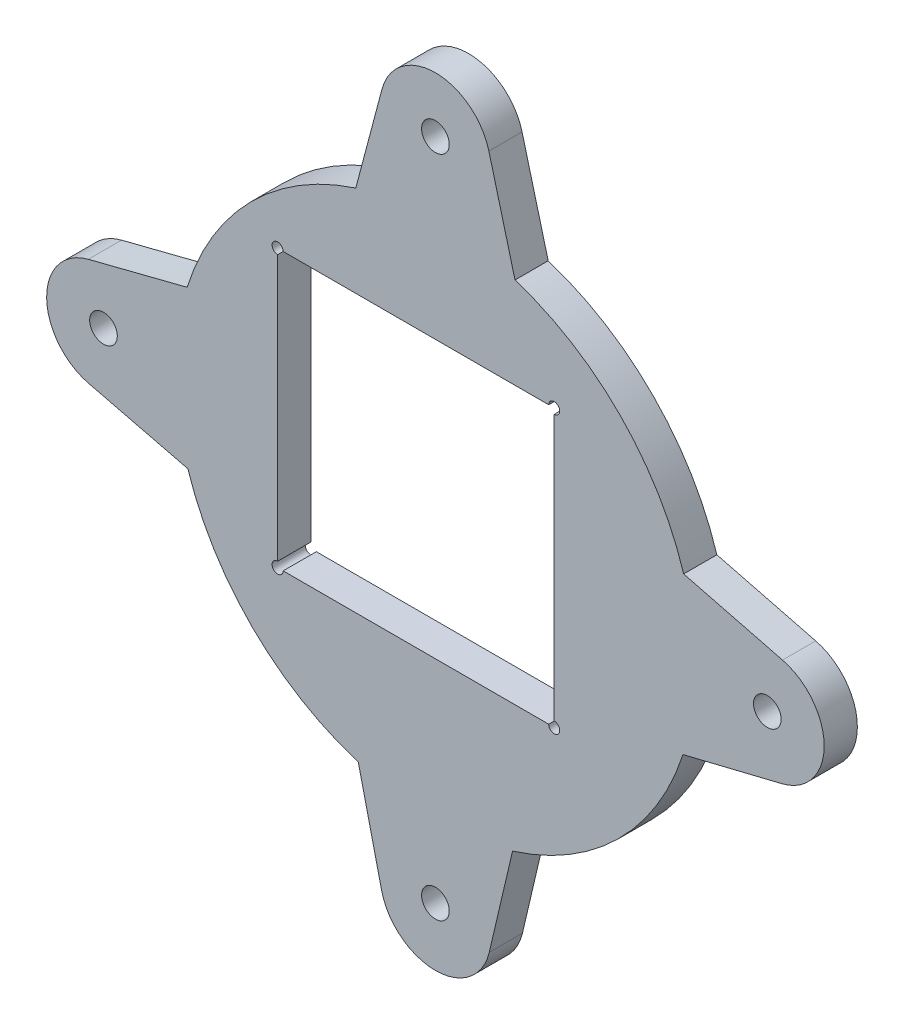
ISO-10303-21;
HEADER;
FILE_DESCRIPTION(('STEP AP214'),'2;1');
FILE_NAME('part.step','',(''),(''),'','','');
FILE_SCHEMA(('AUTOMOTIVE_DESIGN { 1 0 10303 214 1 1 1 1 }'));
ENDSEC;
DATA;
#1=APPLICATION_CONTEXT('core data for automotive mechanical design processes');
#2=APPLICATION_PROTOCOL_DEFINITION('international standard','automotive_design',2000,#1);
#3=PRODUCT_CONTEXT('',#1,'mechanical');
#4=PRODUCT('Part','Part','',(#3));
#5=PRODUCT_RELATED_PRODUCT_CATEGORY('part','',(#4));
#6=PRODUCT_DEFINITION_FORMATION('','',#4);
#7=PRODUCT_DEFINITION_CONTEXT('part definition',#1,'design');
#8=PRODUCT_DEFINITION('design','',#6,#7);
#9=PRODUCT_DEFINITION_SHAPE('','',#8);
#10=(LENGTH_UNIT() NAMED_UNIT(*) SI_UNIT(.MILLI.,.METRE.));
#11=(NAMED_UNIT(*) PLANE_ANGLE_UNIT() SI_UNIT($,.RADIAN.));
#12=(NAMED_UNIT(*) SI_UNIT($,.STERADIAN.) SOLID_ANGLE_UNIT());
#13=UNCERTAINTY_MEASURE_WITH_UNIT(LENGTH_MEASURE(1.E-05),#10,'distance_accuracy_value','');
#14=(GEOMETRIC_REPRESENTATION_CONTEXT(3) GLOBAL_UNCERTAINTY_ASSIGNED_CONTEXT((#13)) GLOBAL_UNIT_ASSIGNED_CONTEXT((#10,
#11,#12)) REPRESENTATION_CONTEXT('',''));
#15=CARTESIAN_POINT('',(0.,0.,0.));
#16=DIRECTION('',(0.,0.,1.));
#17=DIRECTION('',(1.,0.,0.));
#18=AXIS2_PLACEMENT_3D('',#15,#16,#17);
#19=CARTESIAN_POINT('',(-1.85100391915683,25.766212817904,3.));
#20=DIRECTION('',(0.,0.,-1.));
#21=DIRECTION('',(-1.,0.,0.));
#22=AXIS2_PLACEMENT_3D('',#19,#20,#21);
#23=PLANE('',#22);
#24=CARTESIAN_POINT('',(-1.85100391915683,25.766212817904,3.));
#25=DIRECTION('',(0.,0.,1.));
#26=DIRECTION('',(1.,0.,0.));
#27=AXIS2_PLACEMENT_3D('',#24,#25,#26);
#28=CIRCLE('',#27,1.25);
#29=CARTESIAN_POINT('',(-0.601003919156825,25.766212817904,3.));
#30=VERTEX_POINT('',#29);
#31=EDGE_CURVE('E243',#30,#30,#28,.T.);
#32=ORIENTED_EDGE('',*,*,#31,.F.);
#33=EDGE_LOOP('',(#32));
#34=FACE_BOUND('',#33,.T.);
#35=CARTESIAN_POINT('',(-1.85100391915683,25.766212817904,3.));
#36=DIRECTION('',(0.,0.,1.));
#37=DIRECTION('',(-1.,0.,0.));
#38=AXIS2_PLACEMENT_3D('',#35,#36,#37);
#39=CIRCLE('',#38,5.00000000000001);
#40=CARTESIAN_POINT('',(2.9820860078737,27.047322398399,3.));
#41=VERTEX_POINT('',#40);
#42=CARTESIAN_POINT('',(-6.68409384618735,27.047322398399,3.));
#43=VERTEX_POINT('',#42);
#44=EDGE_CURVE('E249',#41,#43,#39,.T.);
#45=ORIENTED_EDGE('',*,*,#44,.T.);
#46=DIRECTION('',(-0.256221916098996,-0.966617985406106,0.));
#47=VECTOR('',#46,1.);
#48=CARTESIAN_POINT('',(-6.68409384618735,27.047322398399,3.));
#49=LINE('',#48,#47);
#50=CARTESIAN_POINT('',(-9.04575980234955,18.137745795804,3.));
#51=VERTEX_POINT('',#50);
#52=EDGE_CURVE('E252',#43,#51,#49,.T.);
#53=ORIENTED_EDGE('',*,*,#52,.T.);
#54=CARTESIAN_POINT('',(-1.85100391915683,-4.23378718209599,3.));
#55=DIRECTION('',(0.,0.,1.));
#56=DIRECTION('',(-1.,0.,0.));
#57=AXIS2_PLACEMENT_3D('',#54,#55,#56);
#58=CIRCLE('',#57,23.5);
#59=CARTESIAN_POINT('',(-24.2894466993746,2.74949897836564,3.));
#60=VERTEX_POINT('',#59);
#61=EDGE_CURVE('E255',#51,#60,#58,.T.);
#62=ORIENTED_EDGE('',*,*,#61,.T.);
#63=DIRECTION('',(-0.969071104621837,-0.246781673118191,0.));
#64=VECTOR('',#63,1.);
#65=CARTESIAN_POINT('',(-33.2216343581447,0.474846267616262,3.));
#66=LINE('',#65,#64);
#67=CARTESIAN_POINT('',(-33.2216343581447,0.474846267616262,3.));
#68=VERTEX_POINT('',#67);
#69=EDGE_CURVE('E257',#60,#68,#66,.T.);
#70=ORIENTED_EDGE('',*,*,#69,.T.);
#71=CARTESIAN_POINT('',(-31.9877259925537,-4.37050925549292,3.));
#72=DIRECTION('',(0.,0.,1.));
#73=DIRECTION('',(-1.,0.,0.));
#74=AXIS2_PLACEMENT_3D('',#71,#72,#73);
#75=CIRCLE('',#74,5.);
#76=CARTESIAN_POINT('',(-33.177620363607,-9.226860909331,3.));
#77=VERTEX_POINT('',#76);
#78=EDGE_CURVE('E259',#68,#77,#75,.T.);
#79=ORIENTED_EDGE('',*,*,#78,.T.);
#80=DIRECTION('',(0.971270330767615,-0.237978874210649,0.));
#81=VECTOR('',#80,1.);
#82=CARTESIAN_POINT('',(-33.177620363607,-9.22686090933099,3.));
#83=LINE('',#82,#81);
#84=CARTESIAN_POINT('',(-24.22516184902,-11.4203758672472,3.));
#85=VERTEX_POINT('',#84);
#86=EDGE_CURVE('E261',#77,#85,#83,.T.);
#87=ORIENTED_EDGE('',*,*,#86,.T.);
#88=CARTESIAN_POINT('',(-1.85100391915678,-4.23378718209597,3.));
#89=DIRECTION('',(0.,0.,1.));
#90=DIRECTION('',(-1.,0.,0.));
#91=AXIS2_PLACEMENT_3D('',#88,#89,#90);
#92=CIRCLE('',#91,23.5000000000001);
#93=CARTESIAN_POINT('',(-8.82390605255737,-26.6754590413408,3.));
#94=VERTEX_POINT('',#93);
#95=EDGE_CURVE('E263',#85,#94,#92,.T.);
#96=ORIENTED_EDGE('',*,*,#95,.T.);
#97=DIRECTION('',(0.228380275607533,-0.973572005407626,0.));
#98=VECTOR('',#97,1.);
#99=CARTESIAN_POINT('',(-6.71886394619494,-35.6491327069275,3.));
#100=LINE('',#99,#98);
#101=CARTESIAN_POINT('',(-6.71886394619494,-35.6491327069275,3.));
#102=VERTEX_POINT('',#101);
#103=EDGE_CURVE('E265',#94,#102,#100,.T.);
#104=ORIENTED_EDGE('',*,*,#103,.T.);
#105=CARTESIAN_POINT('',(-1.85100391915681,-34.5072313288898,3.));
#106=DIRECTION('',(0.,0.,1.));
#107=DIRECTION('',(-1.,0.,0.));
#108=AXIS2_PLACEMENT_3D('',#105,#106,#107);
#109=CIRCLE('',#108,5.00000000000001);
#110=CARTESIAN_POINT('',(3.01685610788133,-35.6491327069275,3.));
#111=VERTEX_POINT('',#110);
#112=EDGE_CURVE('E267',#102,#111,#109,.T.);
#113=ORIENTED_EDGE('',*,*,#112,.T.);
#114=DIRECTION('',(0.228380275607522,0.973572005407629,0.));
#115=VECTOR('',#114,1.);
#116=CARTESIAN_POINT('',(3.01685610788133,-35.6491327069275,3.));
#117=LINE('',#116,#115);
#118=CARTESIAN_POINT('',(5.12189821424365,-26.6754590413408,3.));
#119=VERTEX_POINT('',#118);
#120=EDGE_CURVE('E269',#111,#119,#117,.T.);
#121=ORIENTED_EDGE('',*,*,#120,.T.);
#122=CARTESIAN_POINT('',(-1.85100391915683,-4.23378718209599,3.));
#123=DIRECTION('',(0.,0.,1.));
#124=DIRECTION('',(-1.,0.,0.));
#125=AXIS2_PLACEMENT_3D('',#122,#123,#124);
#126=CIRCLE('',#125,23.5);
#127=CARTESIAN_POINT('',(20.5231540107063,-11.4203758672472,3.));
#128=VERTEX_POINT('',#127);
#129=EDGE_CURVE('E271',#119,#128,#126,.T.);
#130=ORIENTED_EDGE('',*,*,#129,.T.);
#131=DIRECTION('',(0.971270330767615,0.23797887421065,0.));
#132=VECTOR('',#131,1.);
#133=CARTESIAN_POINT('',(29.4756125252933,-9.22686090933097,3.));
#134=LINE('',#133,#132);
#135=CARTESIAN_POINT('',(29.4756125252933,-9.22686090933097,3.));
#136=VERTEX_POINT('',#135);
#137=EDGE_CURVE('E273',#128,#136,#134,.T.);
#138=ORIENTED_EDGE('',*,*,#137,.T.);
#139=CARTESIAN_POINT('',(28.2857181542401,-4.37050925549289,3.));
#140=DIRECTION('',(0.,0.,1.));
#141=DIRECTION('',(-1.,0.,0.));
#142=AXIS2_PLACEMENT_3D('',#139,#140,#141);
#143=CIRCLE('',#142,5.);
#144=CARTESIAN_POINT('',(29.519626519831,0.474846267616296,3.));
#145=VERTEX_POINT('',#144);
#146=EDGE_CURVE('E275',#136,#145,#143,.T.);
#147=ORIENTED_EDGE('',*,*,#146,.T.);
#148=DIRECTION('',(-0.969071104621838,0.246781673118186,0.));
#149=VECTOR('',#148,1.);
#150=CARTESIAN_POINT('',(29.519626519831,0.474846267616294,3.));
#151=LINE('',#150,#149);
#152=CARTESIAN_POINT('',(20.5874388610609,2.74949897836561,3.));
#153=VERTEX_POINT('',#152);
#154=EDGE_CURVE('E277',#145,#153,#151,.T.);
#155=ORIENTED_EDGE('',*,*,#154,.T.);
#156=CARTESIAN_POINT('',(-1.85100391915683,-4.23378718209599,3.));
#157=DIRECTION('',(0.,0.,1.));
#158=DIRECTION('',(-1.,0.,0.));
#159=AXIS2_PLACEMENT_3D('',#156,#157,#158);
#160=CIRCLE('',#159,23.5);
#161=CARTESIAN_POINT('',(5.3437519640359,18.137745795804,3.));
#162=VERTEX_POINT('',#161);
#163=EDGE_CURVE('E279',#153,#162,#160,.T.);
#164=ORIENTED_EDGE('',*,*,#163,.T.);
#165=DIRECTION('',(-0.256221916098997,0.966617985406106,0.));
#166=VECTOR('',#165,1.);
#167=CARTESIAN_POINT('',(2.9820860078737,27.047322398399,3.));
#168=LINE('',#167,#166);
#169=EDGE_CURVE('E281',#162,#41,#168,.T.);
#170=ORIENTED_EDGE('',*,*,#169,.T.);
#171=EDGE_LOOP('',(#45,#53,#62,#70,#79,#87,#96,#104,#113,#121,#130,#138,#147,#155,#164,#170));
#172=FACE_BOUND('',#171,.T.);
#173=DIRECTION('',(1.,0.,0.));
#174=VECTOR('',#173,1.);
#175=CARTESIAN_POINT('',(-16.1130746243856,-15.1084385502642,3.));
#176=LINE('',#175,#174);
#177=CARTESIAN_POINT('',(-15.6130746243856,-15.1084385502642,3.));
#178=VERTEX_POINT('',#177);
#179=CARTESIAN_POINT('',(8.38692537561444,-15.1084385502642,3.));
#180=VERTEX_POINT('',#179);
#181=EDGE_CURVE('E233',#178,#180,#176,.T.);
#182=ORIENTED_EDGE('',*,*,#181,.F.);
#183=CARTESIAN_POINT('',(-16.1130746243856,-15.1084385502642,3.));
#184=DIRECTION('',(0.,0.,1.));
#185=DIRECTION('',(1.,0.,0.));
#186=AXIS2_PLACEMENT_3D('',#183,#184,#185);
#187=CIRCLE('',#186,0.499999999999999);
#188=CARTESIAN_POINT('',(-16.1130746243856,-14.6084385502642,3.));
#189=VERTEX_POINT('',#188);
#190=EDGE_CURVE('E203',#189,#178,#187,.T.);
#191=ORIENTED_EDGE('',*,*,#190,.F.);
#192=DIRECTION('',(0.,-1.,0.));
#193=VECTOR('',#192,1.);
#194=CARTESIAN_POINT('',(-16.1130746243856,-15.1084385502642,3.));
#195=LINE('',#194,#193);
#196=CARTESIAN_POINT('',(-16.1130746243856,9.39156144973582,3.));
#197=VERTEX_POINT('',#196);
#198=EDGE_CURVE('E222',#197,#189,#195,.T.);
#199=ORIENTED_EDGE('',*,*,#198,.F.);
#200=CARTESIAN_POINT('',(-16.1130746243856,9.89156144973582,3.));
#201=DIRECTION('',(0.,0.,1.));
#202=DIRECTION('',(1.,0.,0.));
#203=AXIS2_PLACEMENT_3D('',#200,#201,#202);
#204=CIRCLE('',#203,0.499999999999999);
#205=CARTESIAN_POINT('',(-15.6130746243856,9.89156144973582,3.));
#206=VERTEX_POINT('',#205);
#207=EDGE_CURVE('E55',#206,#197,#204,.T.);
#208=ORIENTED_EDGE('',*,*,#207,.F.);
#209=DIRECTION('',(-1.,0.,0.));
#210=VECTOR('',#209,1.);
#211=CARTESIAN_POINT('',(-16.1130746243856,9.89156144973582,3.));
#212=LINE('',#211,#210);
#213=CARTESIAN_POINT('',(8.38692537561444,9.89156144973582,3.));
#214=VERTEX_POINT('',#213);
#215=EDGE_CURVE('E218',#214,#206,#212,.T.);
#216=ORIENTED_EDGE('',*,*,#215,.F.);
#217=CARTESIAN_POINT('',(8.88692537561444,9.89156144973582,3.));
#218=DIRECTION('',(0.,0.,1.));
#219=DIRECTION('',(1.,0.,0.));
#220=AXIS2_PLACEMENT_3D('',#217,#218,#219);
#221=CIRCLE('',#220,0.500000000000001);
#222=CARTESIAN_POINT('',(8.88692537561444,9.39156144973582,3.));
#223=VERTEX_POINT('',#222);
#224=EDGE_CURVE('E47',#223,#214,#221,.T.);
#225=ORIENTED_EDGE('',*,*,#224,.F.);
#226=DIRECTION('',(0.,1.,0.));
#227=VECTOR('',#226,1.);
#228=CARTESIAN_POINT('',(8.88692537561444,-15.1084385502642,3.));
#229=LINE('',#228,#227);
#230=CARTESIAN_POINT('',(8.88692537561444,-14.6084385502642,3.));
#231=VERTEX_POINT('',#230);
#232=EDGE_CURVE('E210',#231,#223,#229,.T.);
#233=ORIENTED_EDGE('',*,*,#232,.F.);
#234=CARTESIAN_POINT('',(8.88692537561444,-15.1084385502642,3.));
#235=DIRECTION('',(0.,0.,1.));
#236=DIRECTION('',(1.,0.,0.));
#237=AXIS2_PLACEMENT_3D('',#234,#235,#236);
#238=CIRCLE('',#237,0.500000000000001);
#239=EDGE_CURVE('E192',#180,#231,#238,.T.);
#240=ORIENTED_EDGE('',*,*,#239,.F.);
#241=EDGE_LOOP('',(#182,#191,#199,#208,#216,#225,#233,#240));
#242=FACE_BOUND('',#241,.T.);
#243=CARTESIAN_POINT('',(28.1489960808432,-4.23378718209599,3.));
#244=DIRECTION('',(0.,0.,1.));
#245=DIRECTION('',(1.,0.,0.));
#246=AXIS2_PLACEMENT_3D('',#243,#244,#245);
#247=CIRCLE('',#246,1.25);
#248=CARTESIAN_POINT('',(29.3989960808432,-4.23378718209599,3.));
#249=VERTEX_POINT('',#248);
#250=EDGE_CURVE('E238',#249,#249,#247,.T.);
#251=ORIENTED_EDGE('',*,*,#250,.F.);
#252=EDGE_LOOP('',(#251));
#253=FACE_BOUND('',#252,.T.);
#254=CARTESIAN_POINT('',(-1.85100391915682,-34.233787182096,3.));
#255=DIRECTION('',(0.,0.,1.));
#256=DIRECTION('',(1.,0.,0.));
#257=AXIS2_PLACEMENT_3D('',#254,#255,#256);
#258=CIRCLE('',#257,1.25);
#259=CARTESIAN_POINT('',(-0.601003919156821,-34.233787182096,3.));
#260=VERTEX_POINT('',#259);
#261=EDGE_CURVE('E399',#260,#260,#258,.T.);
#262=ORIENTED_EDGE('',*,*,#261,.F.);
#263=EDGE_LOOP('',(#262));
#264=FACE_BOUND('',#263,.T.);
#265=CARTESIAN_POINT('',(-31.8510039191568,-4.233787182096,3.));
#266=DIRECTION('',(0.,0.,1.));
#267=DIRECTION('',(1.,0.,0.));
#268=AXIS2_PLACEMENT_3D('',#265,#266,#267);
#269=CIRCLE('',#268,1.25);
#270=CARTESIAN_POINT('',(-30.6010039191568,-4.233787182096,3.));
#271=VERTEX_POINT('',#270);
#272=EDGE_CURVE('E393',#271,#271,#269,.T.);
#273=ORIENTED_EDGE('',*,*,#272,.F.);
#274=EDGE_LOOP('',(#273));
#275=FACE_BOUND('',#274,.T.);
#276=ADVANCED_FACE('F33',(#34,#172,#242,#253,#264,#275),#23,.F.);
#277=CARTESIAN_POINT('',(-1.85100391915683,25.766212817904,0.));
#278=DIRECTION('',(0.,0.,-1.));
#279=DIRECTION('',(-1.,0.,0.));
#280=AXIS2_PLACEMENT_3D('',#277,#278,#279);
#281=PLANE('',#280);
#282=CARTESIAN_POINT('',(-16.1130746243856,-15.1084385502642,0.));
#283=DIRECTION('',(0.,0.,-1.));
#284=DIRECTION('',(-1.,0.,0.));
#285=AXIS2_PLACEMENT_3D('',#282,#283,#284);
#286=CIRCLE('',#285,0.499999999999999);
#287=CARTESIAN_POINT('',(-15.6130746243856,-15.1084385502642,0.));
#288=VERTEX_POINT('',#287);
#289=CARTESIAN_POINT('',(-16.1130746243856,-14.6084385502642,0.));
#290=VERTEX_POINT('',#289);
#291=EDGE_CURVE('E213',#288,#290,#286,.T.);
#292=ORIENTED_EDGE('',*,*,#291,.F.);
#293=DIRECTION('',(1.,0.,0.));
#294=VECTOR('',#293,1.);
#295=CARTESIAN_POINT('',(-16.1130746243856,-15.1084385502642,0.));
#296=LINE('',#295,#294);
#297=CARTESIAN_POINT('',(8.38692537561444,-15.1084385502642,0.));
#298=VERTEX_POINT('',#297);
#299=EDGE_CURVE('E219',#288,#298,#296,.T.);
#300=ORIENTED_EDGE('',*,*,#299,.T.);
#301=CARTESIAN_POINT('',(8.88692537561444,-15.1084385502642,0.));
#302=DIRECTION('',(0.,0.,-1.));
#303=DIRECTION('',(-1.,0.,0.));
#304=AXIS2_PLACEMENT_3D('',#301,#302,#303);
#305=CIRCLE('',#304,0.500000000000001);
#306=CARTESIAN_POINT('',(8.88692537561444,-14.6084385502642,0.));
#307=VERTEX_POINT('',#306);
#308=EDGE_CURVE('E214',#307,#298,#305,.T.);
#309=ORIENTED_EDGE('',*,*,#308,.F.);
#310=DIRECTION('',(0.,1.,0.));
#311=VECTOR('',#310,1.);
#312=CARTESIAN_POINT('',(8.88692537561444,-15.1084385502642,0.));
#313=LINE('',#312,#311);
#314=CARTESIAN_POINT('',(8.88692537561444,9.39156144973582,0.));
#315=VERTEX_POINT('',#314);
#316=EDGE_CURVE('E212',#307,#315,#313,.T.);
#317=ORIENTED_EDGE('',*,*,#316,.T.);
#318=CARTESIAN_POINT('',(8.88692537561444,9.89156144973582,0.));
#319=DIRECTION('',(0.,0.,-1.));
#320=DIRECTION('',(-1.,0.,0.));
#321=AXIS2_PLACEMENT_3D('',#318,#319,#320);
#322=CIRCLE('',#321,0.500000000000001);
#323=CARTESIAN_POINT('',(8.38692537561444,9.89156144973582,0.));
#324=VERTEX_POINT('',#323);
#325=EDGE_CURVE('E388',#324,#315,#322,.T.);
#326=ORIENTED_EDGE('',*,*,#325,.F.);
#327=DIRECTION('',(-1.,0.,0.));
#328=VECTOR('',#327,1.);
#329=CARTESIAN_POINT('',(-16.1130746243856,9.89156144973582,0.));
#330=LINE('',#329,#328);
#331=CARTESIAN_POINT('',(-15.6130746243856,9.89156144973582,0.));
#332=VERTEX_POINT('',#331);
#333=EDGE_CURVE('E237',#324,#332,#330,.T.);
#334=ORIENTED_EDGE('',*,*,#333,.T.);
#335=CARTESIAN_POINT('',(-16.1130746243856,9.89156144973582,0.));
#336=DIRECTION('',(0.,0.,-1.));
#337=DIRECTION('',(-1.,0.,0.));
#338=AXIS2_PLACEMENT_3D('',#335,#336,#337);
#339=CIRCLE('',#338,0.499999999999999);
#340=CARTESIAN_POINT('',(-16.1130746243856,9.39156144973582,0.));
#341=VERTEX_POINT('',#340);
#342=EDGE_CURVE('E366',#341,#332,#339,.T.);
#343=ORIENTED_EDGE('',*,*,#342,.F.);
#344=DIRECTION('',(0.,-1.,0.));
#345=VECTOR('',#344,1.);
#346=CARTESIAN_POINT('',(-16.1130746243856,-15.1084385502642,0.));
#347=LINE('',#346,#345);
#348=EDGE_CURVE('E225',#341,#290,#347,.T.);
#349=ORIENTED_EDGE('',*,*,#348,.T.);
#350=EDGE_LOOP('',(#292,#300,#309,#317,#326,#334,#343,#349));
#351=FACE_BOUND('',#350,.T.);
#352=CARTESIAN_POINT('',(-1.85100391915682,-34.233787182096,0.));
#353=DIRECTION('',(0.,0.,1.));
#354=DIRECTION('',(1.,0.,0.));
#355=AXIS2_PLACEMENT_3D('',#352,#353,#354);
#356=CIRCLE('',#355,1.25);
#357=CARTESIAN_POINT('',(-0.601003919156821,-34.233787182096,0.));
#358=VERTEX_POINT('',#357);
#359=EDGE_CURVE('E396',#358,#358,#356,.T.);
#360=ORIENTED_EDGE('',*,*,#359,.T.);
#361=EDGE_LOOP('',(#360));
#362=FACE_BOUND('',#361,.T.);
#363=CARTESIAN_POINT('',(-1.85100391915683,25.766212817904,0.));
#364=DIRECTION('',(0.,0.,1.));
#365=DIRECTION('',(1.,0.,0.));
#366=AXIS2_PLACEMENT_3D('',#363,#364,#365);
#367=CIRCLE('',#366,1.25);
#368=CARTESIAN_POINT('',(-0.601003919156825,25.766212817904,0.));
#369=VERTEX_POINT('',#368);
#370=EDGE_CURVE('E235',#369,#369,#367,.T.);
#371=ORIENTED_EDGE('',*,*,#370,.T.);
#372=EDGE_LOOP('',(#371));
#373=FACE_BOUND('',#372,.T.);
#374=CARTESIAN_POINT('',(-1.85100391915683,25.766212817904,0.));
#375=DIRECTION('',(0.,0.,1.));
#376=DIRECTION('',(-1.,0.,0.));
#377=AXIS2_PLACEMENT_3D('',#374,#375,#376);
#378=CIRCLE('',#377,5.00000000000001);
#379=CARTESIAN_POINT('',(2.9820860078737,27.047322398399,0.));
#380=VERTEX_POINT('',#379);
#381=CARTESIAN_POINT('',(-6.68409384618735,27.047322398399,0.));
#382=VERTEX_POINT('',#381);
#383=EDGE_CURVE('E246',#380,#382,#378,.T.);
#384=ORIENTED_EDGE('',*,*,#383,.F.);
#385=DIRECTION('',(-0.256221916098997,0.966617985406106,0.));
#386=VECTOR('',#385,1.);
#387=CARTESIAN_POINT('',(2.9820860078737,27.047322398399,0.));
#388=LINE('',#387,#386);
#389=CARTESIAN_POINT('',(5.3437519640359,18.137745795804,0.));
#390=VERTEX_POINT('',#389);
#391=EDGE_CURVE('E253',#390,#380,#388,.T.);
#392=ORIENTED_EDGE('',*,*,#391,.F.);
#393=CARTESIAN_POINT('',(-1.85100391915683,-4.23378718209599,0.));
#394=DIRECTION('',(0.,0.,1.));
#395=DIRECTION('',(-1.,0.,0.));
#396=AXIS2_PLACEMENT_3D('',#393,#394,#395);
#397=CIRCLE('',#396,23.5);
#398=CARTESIAN_POINT('',(20.5874388610609,2.74949897836561,0.));
#399=VERTEX_POINT('',#398);
#400=EDGE_CURVE('E312',#399,#390,#397,.T.);
#401=ORIENTED_EDGE('',*,*,#400,.F.);
#402=DIRECTION('',(-0.969071104621838,0.246781673118186,0.));
#403=VECTOR('',#402,1.);
#404=CARTESIAN_POINT('',(29.519626519831,0.474846267616294,0.));
#405=LINE('',#404,#403);
#406=CARTESIAN_POINT('',(29.519626519831,0.474846267616296,0.));
#407=VERTEX_POINT('',#406);
#408=EDGE_CURVE('E310',#407,#399,#405,.T.);
#409=ORIENTED_EDGE('',*,*,#408,.F.);
#410=CARTESIAN_POINT('',(28.2857181542401,-4.37050925549289,0.));
#411=DIRECTION('',(0.,0.,1.));
#412=DIRECTION('',(-1.,0.,0.));
#413=AXIS2_PLACEMENT_3D('',#410,#411,#412);
#414=CIRCLE('',#413,5.);
#415=CARTESIAN_POINT('',(29.4756125252933,-9.22686090933097,0.));
#416=VERTEX_POINT('',#415);
#417=EDGE_CURVE('E308',#416,#407,#414,.T.);
#418=ORIENTED_EDGE('',*,*,#417,.F.);
#419=DIRECTION('',(0.971270330767615,0.23797887421065,0.));
#420=VECTOR('',#419,1.);
#421=CARTESIAN_POINT('',(29.4756125252933,-9.22686090933097,0.));
#422=LINE('',#421,#420);
#423=CARTESIAN_POINT('',(20.5231540107063,-11.4203758672472,0.));
#424=VERTEX_POINT('',#423);
#425=EDGE_CURVE('E306',#424,#416,#422,.T.);
#426=ORIENTED_EDGE('',*,*,#425,.F.);
#427=CARTESIAN_POINT('',(-1.85100391915683,-4.23378718209599,0.));
#428=DIRECTION('',(0.,0.,1.));
#429=DIRECTION('',(-1.,0.,0.));
#430=AXIS2_PLACEMENT_3D('',#427,#428,#429);
#431=CIRCLE('',#430,23.5);
#432=CARTESIAN_POINT('',(5.12189821424365,-26.6754590413408,0.));
#433=VERTEX_POINT('',#432);
#434=EDGE_CURVE('E304',#433,#424,#431,.T.);
#435=ORIENTED_EDGE('',*,*,#434,.F.);
#436=DIRECTION('',(0.228380275607522,0.973572005407629,0.));
#437=VECTOR('',#436,1.);
#438=CARTESIAN_POINT('',(3.01685610788133,-35.6491327069275,0.));
#439=LINE('',#438,#437);
#440=CARTESIAN_POINT('',(3.01685610788133,-35.6491327069275,0.));
#441=VERTEX_POINT('',#440);
#442=EDGE_CURVE('E302',#441,#433,#439,.T.);
#443=ORIENTED_EDGE('',*,*,#442,.F.);
#444=CARTESIAN_POINT('',(-1.85100391915681,-34.5072313288898,0.));
#445=DIRECTION('',(0.,0.,1.));
#446=DIRECTION('',(-1.,0.,0.));
#447=AXIS2_PLACEMENT_3D('',#444,#445,#446);
#448=CIRCLE('',#447,5.00000000000001);
#449=CARTESIAN_POINT('',(-6.71886394619494,-35.6491327069275,0.));
#450=VERTEX_POINT('',#449);
#451=EDGE_CURVE('E300',#450,#441,#448,.T.);
#452=ORIENTED_EDGE('',*,*,#451,.F.);
#453=DIRECTION('',(0.228380275607533,-0.973572005407626,0.));
#454=VECTOR('',#453,1.);
#455=CARTESIAN_POINT('',(-6.71886394619494,-35.6491327069275,0.));
#456=LINE('',#455,#454);
#457=CARTESIAN_POINT('',(-8.82390605255737,-26.6754590413408,0.));
#458=VERTEX_POINT('',#457);
#459=EDGE_CURVE('E298',#458,#450,#456,.T.);
#460=ORIENTED_EDGE('',*,*,#459,.F.);
#461=CARTESIAN_POINT('',(-1.85100391915678,-4.23378718209597,0.));
#462=DIRECTION('',(0.,0.,1.));
#463=DIRECTION('',(-1.,0.,0.));
#464=AXIS2_PLACEMENT_3D('',#461,#462,#463);
#465=CIRCLE('',#464,23.5000000000001);
#466=CARTESIAN_POINT('',(-24.22516184902,-11.4203758672472,0.));
#467=VERTEX_POINT('',#466);
#468=EDGE_CURVE('E296',#467,#458,#465,.T.);
#469=ORIENTED_EDGE('',*,*,#468,.F.);
#470=DIRECTION('',(0.971270330767615,-0.237978874210649,0.));
#471=VECTOR('',#470,1.);
#472=CARTESIAN_POINT('',(-33.177620363607,-9.22686090933099,0.));
#473=LINE('',#472,#471);
#474=CARTESIAN_POINT('',(-33.177620363607,-9.226860909331,0.));
#475=VERTEX_POINT('',#474);
#476=EDGE_CURVE('E294',#475,#467,#473,.T.);
#477=ORIENTED_EDGE('',*,*,#476,.F.);
#478=CARTESIAN_POINT('',(-31.9877259925537,-4.37050925549292,0.));
#479=DIRECTION('',(0.,0.,1.));
#480=DIRECTION('',(-1.,0.,0.));
#481=AXIS2_PLACEMENT_3D('',#478,#479,#480);
#482=CIRCLE('',#481,5.);
#483=CARTESIAN_POINT('',(-33.2216343581447,0.474846267616262,0.));
#484=VERTEX_POINT('',#483);
#485=EDGE_CURVE('E292',#484,#475,#482,.T.);
#486=ORIENTED_EDGE('',*,*,#485,.F.);
#487=DIRECTION('',(-0.969071104621837,-0.246781673118191,0.));
#488=VECTOR('',#487,1.);
#489=CARTESIAN_POINT('',(-33.2216343581447,0.474846267616262,0.));
#490=LINE('',#489,#488);
#491=CARTESIAN_POINT('',(-24.2894466993746,2.74949897836564,0.));
#492=VERTEX_POINT('',#491);
#493=EDGE_CURVE('E290',#492,#484,#490,.T.);
#494=ORIENTED_EDGE('',*,*,#493,.F.);
#495=CARTESIAN_POINT('',(-1.85100391915683,-4.23378718209599,0.));
#496=DIRECTION('',(0.,0.,1.));
#497=DIRECTION('',(-1.,0.,0.));
#498=AXIS2_PLACEMENT_3D('',#495,#496,#497);
#499=CIRCLE('',#498,23.5);
#500=CARTESIAN_POINT('',(-9.04575980234955,18.137745795804,0.));
#501=VERTEX_POINT('',#500);
#502=EDGE_CURVE('E288',#501,#492,#499,.T.);
#503=ORIENTED_EDGE('',*,*,#502,.F.);
#504=DIRECTION('',(-0.256221916098996,-0.966617985406106,0.));
#505=VECTOR('',#504,1.);
#506=CARTESIAN_POINT('',(-6.68409384618735,27.047322398399,0.));
#507=LINE('',#506,#505);
#508=EDGE_CURVE('E286',#382,#501,#507,.T.);
#509=ORIENTED_EDGE('',*,*,#508,.F.);
#510=EDGE_LOOP('',(#384,#392,#401,#409,#418,#426,#435,#443,#452,#460,#469,#477,#486,#494,#503,#509));
#511=FACE_BOUND('',#510,.T.);
#512=CARTESIAN_POINT('',(28.1489960808432,-4.23378718209599,0.));
#513=DIRECTION('',(0.,0.,1.));
#514=DIRECTION('',(1.,0.,0.));
#515=AXIS2_PLACEMENT_3D('',#512,#513,#514);
#516=CIRCLE('',#515,1.25);
#517=CARTESIAN_POINT('',(29.3989960808432,-4.23378718209599,0.));
#518=VERTEX_POINT('',#517);
#519=EDGE_CURVE('E228',#518,#518,#516,.T.);
#520=ORIENTED_EDGE('',*,*,#519,.T.);
#521=EDGE_LOOP('',(#520));
#522=FACE_BOUND('',#521,.T.);
#523=CARTESIAN_POINT('',(-31.8510039191568,-4.233787182096,0.));
#524=DIRECTION('',(0.,0.,1.));
#525=DIRECTION('',(1.,0.,0.));
#526=AXIS2_PLACEMENT_3D('',#523,#524,#525);
#527=CIRCLE('',#526,1.25);
#528=CARTESIAN_POINT('',(-30.6010039191568,-4.233787182096,0.));
#529=VERTEX_POINT('',#528);
#530=EDGE_CURVE('E392',#529,#529,#527,.T.);
#531=ORIENTED_EDGE('',*,*,#530,.T.);
#532=EDGE_LOOP('',(#531));
#533=FACE_BOUND('',#532,.T.);
#534=ADVANCED_FACE('F373',(#351,#362,#373,#511,#522,#533),#281,.T.);
#535=CARTESIAN_POINT('',(-1.85100391915683,25.766212817904,3.));
#536=DIRECTION('',(0.,0.,-1.));
#537=DIRECTION('',(-1.,0.,0.));
#538=AXIS2_PLACEMENT_3D('',#535,#536,#537);
#539=CYLINDRICAL_SURFACE('',#538,5.00000000000001);
#540=ORIENTED_EDGE('',*,*,#383,.T.);
#541=DIRECTION('',(0.,0.,-1.));
#542=VECTOR('',#541,1.);
#543=CARTESIAN_POINT('',(-6.68409384618735,27.047322398399,3.));
#544=LINE('',#543,#542);
#545=EDGE_CURVE('E359',#43,#382,#544,.T.);
#546=ORIENTED_EDGE('',*,*,#545,.F.);
#547=ORIENTED_EDGE('',*,*,#44,.F.);
#548=DIRECTION('',(0.,0.,-1.));
#549=VECTOR('',#548,1.);
#550=CARTESIAN_POINT('',(2.9820860078737,27.047322398399,3.));
#551=LINE('',#550,#549);
#552=EDGE_CURVE('E283',#41,#380,#551,.T.);
#553=ORIENTED_EDGE('',*,*,#552,.T.);
#554=EDGE_LOOP('',(#540,#546,#547,#553));
#555=FACE_BOUND('',#554,.T.);
#556=ADVANCED_FACE('F35',(#555),#539,.T.);
#557=CARTESIAN_POINT('',(-6.68409384618735,27.047322398399,3.));
#558=DIRECTION('',(0.966617985406106,-0.256221916098996,0.));
#559=DIRECTION('',(0.256221916098996,0.966617985406106,0.));
#560=AXIS2_PLACEMENT_3D('',#557,#558,#559);
#561=PLANE('',#560);
#562=ORIENTED_EDGE('',*,*,#508,.T.);
#563=DIRECTION('',(0.,0.,-1.));
#564=VECTOR('',#563,1.);
#565=CARTESIAN_POINT('',(-9.04575980234955,18.137745795804,3.));
#566=LINE('',#565,#564);
#567=EDGE_CURVE('E356',#51,#501,#566,.T.);
#568=ORIENTED_EDGE('',*,*,#567,.F.);
#569=ORIENTED_EDGE('',*,*,#52,.F.);
#570=ORIENTED_EDGE('',*,*,#545,.T.);
#571=EDGE_LOOP('',(#562,#568,#569,#570));
#572=FACE_BOUND('',#571,.T.);
#573=ADVANCED_FACE('F492',(#572),#561,.F.);
#574=CARTESIAN_POINT('',(-1.85100391915683,-4.23378718209599,3.));
#575=DIRECTION('',(0.,0.,-1.));
#576=DIRECTION('',(-1.,0.,0.));
#577=AXIS2_PLACEMENT_3D('',#574,#575,#576);
#578=CYLINDRICAL_SURFACE('',#577,23.5);
#579=ORIENTED_EDGE('',*,*,#502,.T.);
#580=DIRECTION('',(0.,0.,-1.));
#581=VECTOR('',#580,1.);
#582=CARTESIAN_POINT('',(-24.2894466993746,2.74949897836564,3.));
#583=LINE('',#582,#581);
#584=EDGE_CURVE('E353',#60,#492,#583,.T.);
#585=ORIENTED_EDGE('',*,*,#584,.F.);
#586=ORIENTED_EDGE('',*,*,#61,.F.);
#587=ORIENTED_EDGE('',*,*,#567,.T.);
#588=EDGE_LOOP('',(#579,#585,#586,#587));
#589=FACE_BOUND('',#588,.T.);
#590=ADVANCED_FACE('F489',(#589),#578,.T.);
#591=CARTESIAN_POINT('',(-33.2216343581447,0.474846267616262,3.));
#592=DIRECTION('',(0.246781673118191,-0.969071104621836,0.));
#593=DIRECTION('',(0.969071104621837,0.246781673118191,0.));
#594=AXIS2_PLACEMENT_3D('',#591,#592,#593);
#595=PLANE('',#594);
#596=ORIENTED_EDGE('',*,*,#493,.T.);
#597=DIRECTION('',(0.,0.,-1.));
#598=VECTOR('',#597,1.);
#599=CARTESIAN_POINT('',(-33.2216343581447,0.474846267616262,3.));
#600=LINE('',#599,#598);
#601=EDGE_CURVE('E350',#68,#484,#600,.T.);
#602=ORIENTED_EDGE('',*,*,#601,.F.);
#603=ORIENTED_EDGE('',*,*,#69,.F.);
#604=ORIENTED_EDGE('',*,*,#584,.T.);
#605=EDGE_LOOP('',(#596,#602,#603,#604));
#606=FACE_BOUND('',#605,.T.);
#607=ADVANCED_FACE('F485',(#606),#595,.F.);
#608=CARTESIAN_POINT('',(-31.9877259925537,-4.37050925549292,3.));
#609=DIRECTION('',(0.,0.,-1.));
#610=DIRECTION('',(-1.,0.,0.));
#611=AXIS2_PLACEMENT_3D('',#608,#609,#610);
#612=CYLINDRICAL_SURFACE('',#611,5.);
#613=ORIENTED_EDGE('',*,*,#485,.T.);
#614=DIRECTION('',(0.,0.,-1.));
#615=VECTOR('',#614,1.);
#616=CARTESIAN_POINT('',(-33.177620363607,-9.226860909331,3.));
#617=LINE('',#616,#615);
#618=EDGE_CURVE('E347',#77,#475,#617,.T.);
#619=ORIENTED_EDGE('',*,*,#618,.F.);
#620=ORIENTED_EDGE('',*,*,#78,.F.);
#621=ORIENTED_EDGE('',*,*,#601,.T.);
#622=EDGE_LOOP('',(#613,#619,#620,#621));
#623=FACE_BOUND('',#622,.T.);
#624=ADVANCED_FACE('F481',(#623),#612,.T.);
#625=CARTESIAN_POINT('',(-33.177620363607,-9.22686090933099,3.));
#626=DIRECTION('',(0.237978874210649,0.971270330767615,0.));
#627=DIRECTION('',(-0.971270330767615,0.237978874210649,0.));
#628=AXIS2_PLACEMENT_3D('',#625,#626,#627);
#629=PLANE('',#628);
#630=ORIENTED_EDGE('',*,*,#476,.T.);
#631=DIRECTION('',(0.,0.,-1.));
#632=VECTOR('',#631,1.);
#633=CARTESIAN_POINT('',(-24.22516184902,-11.4203758672472,3.));
#634=LINE('',#633,#632);
#635=EDGE_CURVE('E344',#85,#467,#634,.T.);
#636=ORIENTED_EDGE('',*,*,#635,.F.);
#637=ORIENTED_EDGE('',*,*,#86,.F.);
#638=ORIENTED_EDGE('',*,*,#618,.T.);
#639=EDGE_LOOP('',(#630,#636,#637,#638));
#640=FACE_BOUND('',#639,.T.);
#641=ADVANCED_FACE('F477',(#640),#629,.F.);
#642=CARTESIAN_POINT('',(-1.85100391915678,-4.23378718209597,3.));
#643=DIRECTION('',(0.,0.,-1.));
#644=DIRECTION('',(-1.,0.,0.));
#645=AXIS2_PLACEMENT_3D('',#642,#643,#644);
#646=CYLINDRICAL_SURFACE('',#645,23.5000000000001);
#647=ORIENTED_EDGE('',*,*,#468,.T.);
#648=DIRECTION('',(0.,0.,-1.));
#649=VECTOR('',#648,1.);
#650=CARTESIAN_POINT('',(-8.82390605255737,-26.6754590413408,3.));
#651=LINE('',#650,#649);
#652=EDGE_CURVE('E341',#94,#458,#651,.T.);
#653=ORIENTED_EDGE('',*,*,#652,.F.);
#654=ORIENTED_EDGE('',*,*,#95,.F.);
#655=ORIENTED_EDGE('',*,*,#635,.T.);
#656=EDGE_LOOP('',(#647,#653,#654,#655));
#657=FACE_BOUND('',#656,.T.);
#658=ADVANCED_FACE('F473',(#657),#646,.T.);
#659=CARTESIAN_POINT('',(-6.71886394619494,-35.6491327069275,3.));
#660=DIRECTION('',(0.973572005407626,0.228380275607533,0.));
#661=DIRECTION('',(-0.228380275607533,0.973572005407627,0.));
#662=AXIS2_PLACEMENT_3D('',#659,#660,#661);
#663=PLANE('',#662);
#664=ORIENTED_EDGE('',*,*,#459,.T.);
#665=DIRECTION('',(0.,0.,-1.));
#666=VECTOR('',#665,1.);
#667=CARTESIAN_POINT('',(-6.71886394619494,-35.6491327069275,3.));
#668=LINE('',#667,#666);
#669=EDGE_CURVE('E338',#102,#450,#668,.T.);
#670=ORIENTED_EDGE('',*,*,#669,.F.);
#671=ORIENTED_EDGE('',*,*,#103,.F.);
#672=ORIENTED_EDGE('',*,*,#652,.T.);
#673=EDGE_LOOP('',(#664,#670,#671,#672));
#674=FACE_BOUND('',#673,.T.);
#675=ADVANCED_FACE('F469',(#674),#663,.F.);
#676=CARTESIAN_POINT('',(-1.85100391915681,-34.5072313288898,3.));
#677=DIRECTION('',(0.,0.,-1.));
#678=DIRECTION('',(-1.,0.,0.));
#679=AXIS2_PLACEMENT_3D('',#676,#677,#678);
#680=CYLINDRICAL_SURFACE('',#679,5.00000000000001);
#681=ORIENTED_EDGE('',*,*,#451,.T.);
#682=DIRECTION('',(0.,0.,-1.));
#683=VECTOR('',#682,1.);
#684=CARTESIAN_POINT('',(3.01685610788133,-35.6491327069275,3.));
#685=LINE('',#684,#683);
#686=EDGE_CURVE('E335',#111,#441,#685,.T.);
#687=ORIENTED_EDGE('',*,*,#686,.F.);
#688=ORIENTED_EDGE('',*,*,#112,.F.);
#689=ORIENTED_EDGE('',*,*,#669,.T.);
#690=EDGE_LOOP('',(#681,#687,#688,#689));
#691=FACE_BOUND('',#690,.T.);
#692=ADVANCED_FACE('F465',(#691),#680,.T.);
#693=CARTESIAN_POINT('',(3.01685610788133,-35.6491327069275,3.));
#694=DIRECTION('',(-0.973572005407629,0.228380275607522,0.));
#695=DIRECTION('',(-0.228380275607522,-0.973572005407629,0.));
#696=AXIS2_PLACEMENT_3D('',#693,#694,#695);
#697=PLANE('',#696);
#698=ORIENTED_EDGE('',*,*,#442,.T.);
#699=DIRECTION('',(0.,0.,-1.));
#700=VECTOR('',#699,1.);
#701=CARTESIAN_POINT('',(5.12189821424365,-26.6754590413408,3.));
#702=LINE('',#701,#700);
#703=EDGE_CURVE('E332',#119,#433,#702,.T.);
#704=ORIENTED_EDGE('',*,*,#703,.F.);
#705=ORIENTED_EDGE('',*,*,#120,.F.);
#706=ORIENTED_EDGE('',*,*,#686,.T.);
#707=EDGE_LOOP('',(#698,#704,#705,#706));
#708=FACE_BOUND('',#707,.T.);
#709=ADVANCED_FACE('F461',(#708),#697,.F.);
#710=CARTESIAN_POINT('',(-1.85100391915683,-4.23378718209599,3.));
#711=DIRECTION('',(0.,0.,-1.));
#712=DIRECTION('',(-1.,0.,0.));
#713=AXIS2_PLACEMENT_3D('',#710,#711,#712);
#714=CYLINDRICAL_SURFACE('',#713,23.5);
#715=ORIENTED_EDGE('',*,*,#434,.T.);
#716=DIRECTION('',(0.,0.,-1.));
#717=VECTOR('',#716,1.);
#718=CARTESIAN_POINT('',(20.5231540107063,-11.4203758672472,3.));
#719=LINE('',#718,#717);
#720=EDGE_CURVE('E329',#128,#424,#719,.T.);
#721=ORIENTED_EDGE('',*,*,#720,.F.);
#722=ORIENTED_EDGE('',*,*,#129,.F.);
#723=ORIENTED_EDGE('',*,*,#703,.T.);
#724=EDGE_LOOP('',(#715,#721,#722,#723));
#725=FACE_BOUND('',#724,.T.);
#726=ADVANCED_FACE('F457',(#725),#714,.T.);
#727=CARTESIAN_POINT('',(29.4756125252933,-9.22686090933097,3.));
#728=DIRECTION('',(-0.237978874210649,0.971270330767615,0.));
#729=DIRECTION('',(-0.971270330767615,-0.23797887421065,0.));
#730=AXIS2_PLACEMENT_3D('',#727,#728,#729);
#731=PLANE('',#730);
#732=ORIENTED_EDGE('',*,*,#425,.T.);
#733=DIRECTION('',(0.,0.,-1.));
#734=VECTOR('',#733,1.);
#735=CARTESIAN_POINT('',(29.4756125252933,-9.22686090933097,3.));
#736=LINE('',#735,#734);
#737=EDGE_CURVE('E326',#136,#416,#736,.T.);
#738=ORIENTED_EDGE('',*,*,#737,.F.);
#739=ORIENTED_EDGE('',*,*,#137,.F.);
#740=ORIENTED_EDGE('',*,*,#720,.T.);
#741=EDGE_LOOP('',(#732,#738,#739,#740));
#742=FACE_BOUND('',#741,.T.);
#743=ADVANCED_FACE('F453',(#742),#731,.F.);
#744=CARTESIAN_POINT('',(28.2857181542401,-4.37050925549289,3.));
#745=DIRECTION('',(0.,0.,-1.));
#746=DIRECTION('',(-1.,0.,0.));
#747=AXIS2_PLACEMENT_3D('',#744,#745,#746);
#748=CYLINDRICAL_SURFACE('',#747,5.);
#749=ORIENTED_EDGE('',*,*,#417,.T.);
#750=DIRECTION('',(0.,0.,-1.));
#751=VECTOR('',#750,1.);
#752=CARTESIAN_POINT('',(29.519626519831,0.474846267616296,3.));
#753=LINE('',#752,#751);
#754=EDGE_CURVE('E323',#145,#407,#753,.T.);
#755=ORIENTED_EDGE('',*,*,#754,.F.);
#756=ORIENTED_EDGE('',*,*,#146,.F.);
#757=ORIENTED_EDGE('',*,*,#737,.T.);
#758=EDGE_LOOP('',(#749,#755,#756,#757));
#759=FACE_BOUND('',#758,.T.);
#760=ADVANCED_FACE('F449',(#759),#748,.T.);
#761=CARTESIAN_POINT('',(29.519626519831,0.474846267616294,3.));
#762=DIRECTION('',(-0.246781673118186,-0.969071104621838,0.));
#763=DIRECTION('',(0.969071104621838,-0.246781673118186,0.));
#764=AXIS2_PLACEMENT_3D('',#761,#762,#763);
#765=PLANE('',#764);
#766=ORIENTED_EDGE('',*,*,#408,.T.);
#767=DIRECTION('',(0.,0.,-1.));
#768=VECTOR('',#767,1.);
#769=CARTESIAN_POINT('',(20.5874388610609,2.74949897836561,3.));
#770=LINE('',#769,#768);
#771=EDGE_CURVE('E320',#153,#399,#770,.T.);
#772=ORIENTED_EDGE('',*,*,#771,.F.);
#773=ORIENTED_EDGE('',*,*,#154,.F.);
#774=ORIENTED_EDGE('',*,*,#754,.T.);
#775=EDGE_LOOP('',(#766,#772,#773,#774));
#776=FACE_BOUND('',#775,.T.);
#777=ADVANCED_FACE('F445',(#776),#765,.F.);
#778=CARTESIAN_POINT('',(-1.85100391915683,-4.23378718209599,3.));
#779=DIRECTION('',(0.,0.,-1.));
#780=DIRECTION('',(-1.,0.,0.));
#781=AXIS2_PLACEMENT_3D('',#778,#779,#780);
#782=CYLINDRICAL_SURFACE('',#781,23.5);
#783=ORIENTED_EDGE('',*,*,#400,.T.);
#784=DIRECTION('',(0.,0.,-1.));
#785=VECTOR('',#784,1.);
#786=CARTESIAN_POINT('',(5.3437519640359,18.137745795804,3.));
#787=LINE('',#786,#785);
#788=EDGE_CURVE('E317',#162,#390,#787,.T.);
#789=ORIENTED_EDGE('',*,*,#788,.F.);
#790=ORIENTED_EDGE('',*,*,#163,.F.);
#791=ORIENTED_EDGE('',*,*,#771,.T.);
#792=EDGE_LOOP('',(#783,#789,#790,#791));
#793=FACE_BOUND('',#792,.T.);
#794=ADVANCED_FACE('F441',(#793),#782,.T.);
#795=CARTESIAN_POINT('',(2.9820860078737,27.047322398399,3.));
#796=DIRECTION('',(-0.966617985406106,-0.256221916098997,0.));
#797=DIRECTION('',(0.256221916098997,-0.966617985406106,0.));
#798=AXIS2_PLACEMENT_3D('',#795,#796,#797);
#799=PLANE('',#798);
#800=ORIENTED_EDGE('',*,*,#391,.T.);
#801=ORIENTED_EDGE('',*,*,#552,.F.);
#802=ORIENTED_EDGE('',*,*,#169,.F.);
#803=ORIENTED_EDGE('',*,*,#788,.T.);
#804=EDGE_LOOP('',(#800,#801,#802,#803));
#805=FACE_BOUND('',#804,.T.);
#806=ADVANCED_FACE('F438',(#805),#799,.F.);
#807=CARTESIAN_POINT('',(-1.85100391915683,25.766212817904,3.));
#808=DIRECTION('',(0.,0.,-1.));
#809=DIRECTION('',(-1.,0.,0.));
#810=AXIS2_PLACEMENT_3D('',#807,#808,#809);
#811=CYLINDRICAL_SURFACE('',#810,1.25);
#812=ORIENTED_EDGE('',*,*,#31,.T.);
#813=EDGE_LOOP('',(#812));
#814=FACE_BOUND('',#813,.T.);
#815=ORIENTED_EDGE('',*,*,#370,.F.);
#816=EDGE_LOOP('',(#815));
#817=FACE_BOUND('',#816,.T.);
#818=ADVANCED_FACE('F435',(#814,#817),#811,.F.);
#819=CARTESIAN_POINT('',(8.88692537561444,-15.1084385502642,3.));
#820=DIRECTION('',(-1.,0.,0.));
#821=DIRECTION('',(0.,0.,1.));
#822=AXIS2_PLACEMENT_3D('',#819,#820,#821);
#823=PLANE('',#822);
#824=DIRECTION('',(0.,0.,1.));
#825=VECTOR('',#824,1.);
#826=CARTESIAN_POINT('',(8.88692537561444,-14.6084385502642,-7.));
#827=LINE('',#826,#825);
#828=EDGE_CURVE('E195',#231,#307,#827,.F.);
#829=ORIENTED_EDGE('',*,*,#828,.F.);
#830=ORIENTED_EDGE('',*,*,#232,.T.);
#831=DIRECTION('',(0.,0.,1.));
#832=VECTOR('',#831,1.);
#833=CARTESIAN_POINT('',(8.88692537561444,9.39156144973582,-7.));
#834=LINE('',#833,#832);
#835=EDGE_CURVE('E390',#315,#223,#834,.T.);
#836=ORIENTED_EDGE('',*,*,#835,.F.);
#837=ORIENTED_EDGE('',*,*,#316,.F.);
#838=EDGE_LOOP('',(#829,#830,#836,#837));
#839=FACE_BOUND('',#838,.T.);
#840=ADVANCED_FACE('F208',(#839),#823,.T.);
#841=CARTESIAN_POINT('',(-16.1130746243856,9.89156144973582,3.));
#842=DIRECTION('',(0.,-1.,0.));
#843=DIRECTION('',(0.,0.,-1.));
#844=AXIS2_PLACEMENT_3D('',#841,#842,#843);
#845=PLANE('',#844);
#846=DIRECTION('',(0.,0.,1.));
#847=VECTOR('',#846,1.);
#848=CARTESIAN_POINT('',(8.38692537561444,9.89156144973582,-7.));
#849=LINE('',#848,#847);
#850=EDGE_CURVE('E11',#214,#324,#849,.F.);
#851=ORIENTED_EDGE('',*,*,#850,.F.);
#852=ORIENTED_EDGE('',*,*,#215,.T.);
#853=DIRECTION('',(0.,0.,1.));
#854=VECTOR('',#853,1.);
#855=CARTESIAN_POINT('',(-15.6130746243856,9.89156144973582,-7.));
#856=LINE('',#855,#854);
#857=EDGE_CURVE('E377',#332,#206,#856,.T.);
#858=ORIENTED_EDGE('',*,*,#857,.F.);
#859=ORIENTED_EDGE('',*,*,#333,.F.);
#860=EDGE_LOOP('',(#851,#852,#858,#859));
#861=FACE_BOUND('',#860,.T.);
#862=ADVANCED_FACE('F565',(#861),#845,.T.);
#863=CARTESIAN_POINT('',(-16.1130746243856,-15.1084385502642,3.));
#864=DIRECTION('',(1.,0.,0.));
#865=DIRECTION('',(0.,0.,-1.));
#866=AXIS2_PLACEMENT_3D('',#863,#864,#865);
#867=PLANE('',#866);
#868=DIRECTION('',(0.,0.,1.));
#869=VECTOR('',#868,1.);
#870=CARTESIAN_POINT('',(-16.1130746243856,-14.6084385502642,-7.));
#871=LINE('',#870,#869);
#872=EDGE_CURVE('E378',#290,#189,#871,.T.);
#873=ORIENTED_EDGE('',*,*,#872,.F.);
#874=ORIENTED_EDGE('',*,*,#348,.F.);
#875=DIRECTION('',(0.,0.,1.));
#876=VECTOR('',#875,1.);
#877=CARTESIAN_POINT('',(-16.1130746243856,9.39156144973582,-7.));
#878=LINE('',#877,#876);
#879=EDGE_CURVE('E41',#197,#341,#878,.F.);
#880=ORIENTED_EDGE('',*,*,#879,.F.);
#881=ORIENTED_EDGE('',*,*,#198,.T.);
#882=EDGE_LOOP('',(#873,#874,#880,#881));
#883=FACE_BOUND('',#882,.T.);
#884=ADVANCED_FACE('F381',(#883),#867,.T.);
#885=CARTESIAN_POINT('',(-16.1130746243856,-15.1084385502642,3.));
#886=DIRECTION('',(0.,1.,0.));
#887=DIRECTION('',(0.,0.,1.));
#888=AXIS2_PLACEMENT_3D('',#885,#886,#887);
#889=PLANE('',#888);
#890=DIRECTION('',(0.,0.,1.));
#891=VECTOR('',#890,1.);
#892=CARTESIAN_POINT('',(-15.6130746243856,-15.1084385502642,-7.));
#893=LINE('',#892,#891);
#894=EDGE_CURVE('E363',#178,#288,#893,.F.);
#895=ORIENTED_EDGE('',*,*,#894,.F.);
#896=ORIENTED_EDGE('',*,*,#181,.T.);
#897=DIRECTION('',(0.,0.,1.));
#898=VECTOR('',#897,1.);
#899=CARTESIAN_POINT('',(8.38692537561444,-15.1084385502642,-7.));
#900=LINE('',#899,#898);
#901=EDGE_CURVE('E198',#298,#180,#900,.T.);
#902=ORIENTED_EDGE('',*,*,#901,.F.);
#903=ORIENTED_EDGE('',*,*,#299,.F.);
#904=EDGE_LOOP('',(#895,#896,#902,#903));
#905=FACE_BOUND('',#904,.T.);
#906=ADVANCED_FACE('F414',(#905),#889,.T.);
#907=CARTESIAN_POINT('',(28.1489960808432,-4.23378718209599,3.));
#908=DIRECTION('',(0.,0.,-1.));
#909=DIRECTION('',(-1.,0.,0.));
#910=AXIS2_PLACEMENT_3D('',#907,#908,#909);
#911=CYLINDRICAL_SURFACE('',#910,1.25);
#912=ORIENTED_EDGE('',*,*,#250,.T.);
#913=EDGE_LOOP('',(#912));
#914=FACE_BOUND('',#913,.T.);
#915=ORIENTED_EDGE('',*,*,#519,.F.);
#916=EDGE_LOOP('',(#915));
#917=FACE_BOUND('',#916,.T.);
#918=ADVANCED_FACE('F411',(#914,#917),#911,.F.);
#919=CARTESIAN_POINT('',(-1.85100391915682,-34.233787182096,3.));
#920=DIRECTION('',(0.,0.,-1.));
#921=DIRECTION('',(-1.,0.,0.));
#922=AXIS2_PLACEMENT_3D('',#919,#920,#921);
#923=CYLINDRICAL_SURFACE('',#922,1.25);
#924=ORIENTED_EDGE('',*,*,#261,.T.);
#925=EDGE_LOOP('',(#924));
#926=FACE_BOUND('',#925,.T.);
#927=ORIENTED_EDGE('',*,*,#359,.F.);
#928=EDGE_LOOP('',(#927));
#929=FACE_BOUND('',#928,.T.);
#930=ADVANCED_FACE('F413',(#926,#929),#923,.F.);
#931=CARTESIAN_POINT('',(-31.8510039191568,-4.233787182096,3.));
#932=DIRECTION('',(0.,0.,-1.));
#933=DIRECTION('',(-1.,0.,0.));
#934=AXIS2_PLACEMENT_3D('',#931,#932,#933);
#935=CYLINDRICAL_SURFACE('',#934,1.25);
#936=ORIENTED_EDGE('',*,*,#272,.T.);
#937=EDGE_LOOP('',(#936));
#938=FACE_BOUND('',#937,.T.);
#939=ORIENTED_EDGE('',*,*,#530,.F.);
#940=EDGE_LOOP('',(#939));
#941=FACE_BOUND('',#940,.T.);
#942=ADVANCED_FACE('F420',(#938,#941),#935,.F.);
#943=CARTESIAN_POINT('',(8.88692537561444,-15.1084385502642,-7.));
#944=DIRECTION('',(0.,0.,1.));
#945=DIRECTION('',(1.,0.,0.));
#946=AXIS2_PLACEMENT_3D('',#943,#944,#945);
#947=CYLINDRICAL_SURFACE('',#946,0.500000000000001);
#948=ORIENTED_EDGE('',*,*,#828,.T.);
#949=ORIENTED_EDGE('',*,*,#308,.T.);
#950=ORIENTED_EDGE('',*,*,#901,.T.);
#951=ORIENTED_EDGE('',*,*,#239,.T.);
#952=EDGE_LOOP('',(#948,#949,#950,#951));
#953=FACE_BOUND('',#952,.T.);
#954=ADVANCED_FACE('F194',(#953),#947,.F.);
#955=CARTESIAN_POINT('',(-16.1130746243856,-15.1084385502642,-7.));
#956=DIRECTION('',(0.,0.,1.));
#957=DIRECTION('',(1.,0.,0.));
#958=AXIS2_PLACEMENT_3D('',#955,#956,#957);
#959=CYLINDRICAL_SURFACE('',#958,0.499999999999999);
#960=ORIENTED_EDGE('',*,*,#872,.T.);
#961=ORIENTED_EDGE('',*,*,#190,.T.);
#962=ORIENTED_EDGE('',*,*,#894,.T.);
#963=ORIENTED_EDGE('',*,*,#291,.T.);
#964=EDGE_LOOP('',(#960,#961,#962,#963));
#965=FACE_BOUND('',#964,.T.);
#966=ADVANCED_FACE('F599',(#965),#959,.F.);
#967=CARTESIAN_POINT('',(-16.1130746243856,9.89156144973582,-7.));
#968=DIRECTION('',(0.,0.,1.));
#969=DIRECTION('',(1.,0.,0.));
#970=AXIS2_PLACEMENT_3D('',#967,#968,#969);
#971=CYLINDRICAL_SURFACE('',#970,0.499999999999999);
#972=ORIENTED_EDGE('',*,*,#857,.T.);
#973=ORIENTED_EDGE('',*,*,#207,.T.);
#974=ORIENTED_EDGE('',*,*,#879,.T.);
#975=ORIENTED_EDGE('',*,*,#342,.T.);
#976=EDGE_LOOP('',(#972,#973,#974,#975));
#977=FACE_BOUND('',#976,.T.);
#978=ADVANCED_FACE('F365',(#977),#971,.F.);
#979=CARTESIAN_POINT('',(8.88692537561444,9.89156144973582,-7.));
#980=DIRECTION('',(0.,0.,1.));
#981=DIRECTION('',(1.,0.,0.));
#982=AXIS2_PLACEMENT_3D('',#979,#980,#981);
#983=CYLINDRICAL_SURFACE('',#982,0.500000000000001);
#984=ORIENTED_EDGE('',*,*,#835,.T.);
#985=ORIENTED_EDGE('',*,*,#224,.T.);
#986=ORIENTED_EDGE('',*,*,#850,.T.);
#987=ORIENTED_EDGE('',*,*,#325,.T.);
#988=EDGE_LOOP('',(#984,#985,#986,#987));
#989=FACE_BOUND('',#988,.T.);
#990=ADVANCED_FACE('F618',(#989),#983,.F.);
#991=CLOSED_SHELL('',(#276,#534,#556,#573,#590,#607,#624,#641,#658,#675,#692,#709,#726,#743,
#760,#777,#794,#806,#818,#840,#862,#884,#906,#918,#930,#942,#954,#966,#978,#990));
#992=MANIFOLD_SOLID_BREP('B2',#991);
#993=ADVANCED_BREP_SHAPE_REPRESENTATION('',(#18,#992),#14);
#994=SHAPE_DEFINITION_REPRESENTATION(#9,#993);
ENDSEC;
END-ISO-10303-21;
